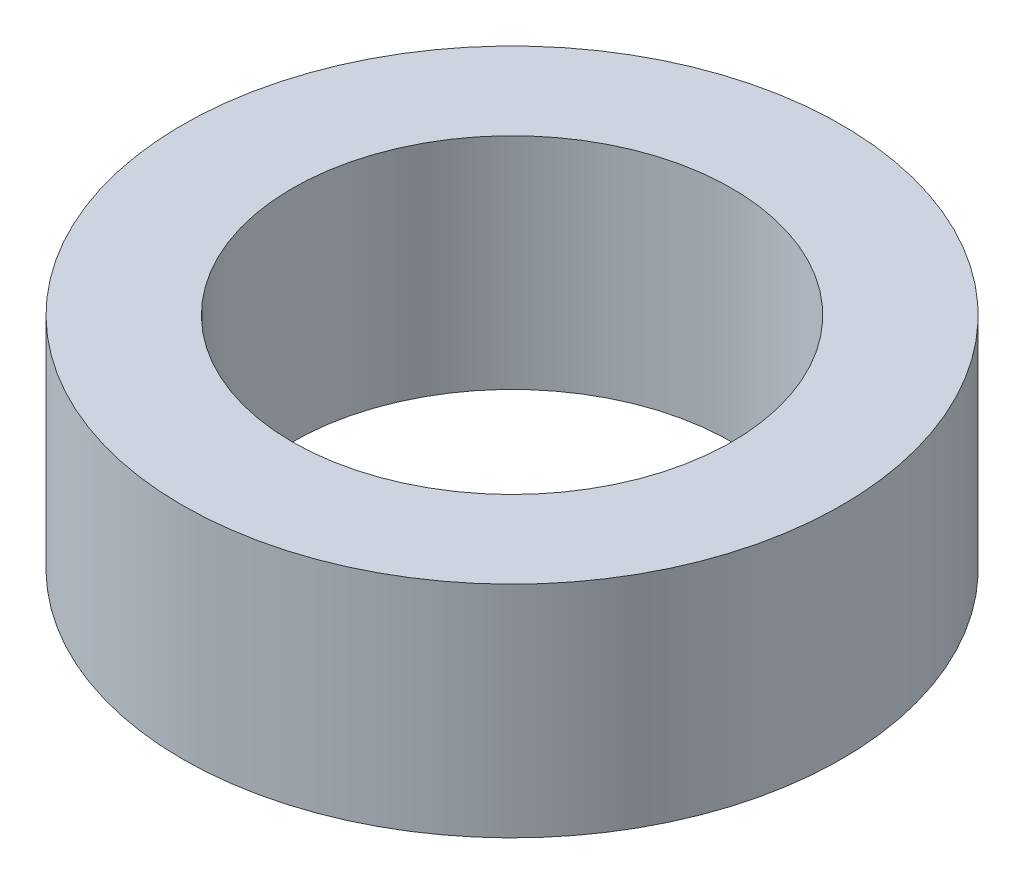
ISO-10303-21;
HEADER;
FILE_DESCRIPTION(('STEP AP214'),'2;1');
FILE_NAME('part.step','',(''),(''),'','','');
FILE_SCHEMA(('AUTOMOTIVE_DESIGN { 1 0 10303 214 1 1 1 1 }'));
ENDSEC;
DATA;
#1=APPLICATION_CONTEXT('core data for automotive mechanical design processes');
#2=APPLICATION_PROTOCOL_DEFINITION('international standard','automotive_design',2000,#1);
#3=PRODUCT_CONTEXT('',#1,'mechanical');
#4=PRODUCT('Part','Part','',(#3));
#5=PRODUCT_RELATED_PRODUCT_CATEGORY('part','',(#4));
#6=PRODUCT_DEFINITION_FORMATION('','',#4);
#7=PRODUCT_DEFINITION_CONTEXT('part definition',#1,'design');
#8=PRODUCT_DEFINITION('design','',#6,#7);
#9=PRODUCT_DEFINITION_SHAPE('','',#8);
#10=(LENGTH_UNIT() NAMED_UNIT(*) SI_UNIT(.MILLI.,.METRE.));
#11=(NAMED_UNIT(*) PLANE_ANGLE_UNIT() SI_UNIT($,.RADIAN.));
#12=(NAMED_UNIT(*) SI_UNIT($,.STERADIAN.) SOLID_ANGLE_UNIT());
#13=UNCERTAINTY_MEASURE_WITH_UNIT(LENGTH_MEASURE(1.E-05),#10,'distance_accuracy_value','');
#14=(GEOMETRIC_REPRESENTATION_CONTEXT(3) GLOBAL_UNCERTAINTY_ASSIGNED_CONTEXT((#13)) GLOBAL_UNIT_ASSIGNED_CONTEXT((#10,
#11,#12)) REPRESENTATION_CONTEXT('',''));
#15=CARTESIAN_POINT('',(0.,0.,0.));
#16=DIRECTION('',(0.,0.,1.));
#17=DIRECTION('',(1.,0.,0.));
#18=AXIS2_PLACEMENT_3D('',#15,#16,#17);
#19=CARTESIAN_POINT('',(0.,0.,0.));
#20=DIRECTION('',(0.,1.,0.));
#21=DIRECTION('',(0.,0.,1.));
#22=AXIS2_PLACEMENT_3D('',#19,#20,#21);
#23=PLANE('',#22);
#24=CARTESIAN_POINT('',(0.,0.,0.));
#25=DIRECTION('',(0.,1.,0.));
#26=DIRECTION('',(0.,0.,1.));
#27=AXIS2_PLACEMENT_3D('',#24,#25,#26);
#28=CIRCLE('',#27,19.05);
#29=CARTESIAN_POINT('',(0.,0.,19.05));
#30=VERTEX_POINT('',#29);
#31=EDGE_CURVE('E49',#30,#30,#28,.T.);
#32=ORIENTED_EDGE('',*,*,#31,.F.);
#33=EDGE_LOOP('',(#32));
#34=FACE_BOUND('',#33,.T.);
#35=CARTESIAN_POINT('',(0.,0.,0.));
#36=DIRECTION('',(0.,-1.,0.));
#37=DIRECTION('',(0.,0.,-1.));
#38=AXIS2_PLACEMENT_3D('',#35,#36,#37);
#39=CIRCLE('',#38,18.9858519733346);
#40=CARTESIAN_POINT('',(0.,0.,-18.9858519733346));
#41=VERTEX_POINT('',#40);
#42=EDGE_CURVE('E72',#41,#41,#39,.T.);
#43=ORIENTED_EDGE('',*,*,#42,.F.);
#44=EDGE_LOOP('',(#43));
#45=FACE_BOUND('',#44,.T.);
#46=ADVANCED_FACE('F45',(#34,#45),#23,.F.);
#47=CARTESIAN_POINT('',(0.,0.,0.));
#48=DIRECTION('',(0.,1.,0.));
#49=DIRECTION('',(0.,0.,1.));
#50=AXIS2_PLACEMENT_3D('',#47,#48,#49);
#51=CIRCLE('',#50,12.7);
#52=CARTESIAN_POINT('',(0.,0.,12.7));
#53=VERTEX_POINT('',#52);
#54=EDGE_CURVE('E62',#53,#53,#51,.T.);
#55=ORIENTED_EDGE('',*,*,#54,.T.);
#56=EDGE_LOOP('',(#55));
#57=FACE_BOUND('',#56,.T.);
#58=CARTESIAN_POINT('',(0.,0.,0.));
#59=DIRECTION('',(0.,-1.,0.));
#60=DIRECTION('',(0.,0.,-1.));
#61=AXIS2_PLACEMENT_3D('',#58,#59,#60);
#62=CIRCLE('',#61,12.7641480266654);
#63=CARTESIAN_POINT('',(0.,0.,-12.7641480266654));
#64=VERTEX_POINT('',#63);
#65=EDGE_CURVE('E65',#64,#64,#62,.T.);
#66=ORIENTED_EDGE('',*,*,#65,.T.);
#67=EDGE_LOOP('',(#66));
#68=FACE_BOUND('',#67,.T.);
#69=ADVANCED_FACE('F83',(#57,#68),#23,.F.);
#70=CARTESIAN_POINT('',(0.,12.7,0.));
#71=DIRECTION('',(0.,-1.,0.));
#72=DIRECTION('',(0.,0.,-1.));
#73=AXIS2_PLACEMENT_3D('',#70,#71,#72);
#74=CYLINDRICAL_SURFACE('',#73,12.7);
#75=CARTESIAN_POINT('',(0.,12.7,0.));
#76=DIRECTION('',(0.,1.,0.));
#77=DIRECTION('',(0.,0.,1.));
#78=AXIS2_PLACEMENT_3D('',#75,#76,#77);
#79=CIRCLE('',#78,12.7);
#80=CARTESIAN_POINT('',(0.,12.7,12.7));
#81=VERTEX_POINT('',#80);
#82=EDGE_CURVE('E54',#81,#81,#79,.T.);
#83=ORIENTED_EDGE('',*,*,#82,.T.);
#84=EDGE_LOOP('',(#83));
#85=FACE_BOUND('',#84,.T.);
#86=ORIENTED_EDGE('',*,*,#54,.F.);
#87=EDGE_LOOP('',(#86));
#88=FACE_BOUND('',#87,.T.);
#89=ADVANCED_FACE('F47',(#85,#88),#74,.F.);
#90=CARTESIAN_POINT('',(0.,12.7,0.));
#91=DIRECTION('',(0.,-1.,0.));
#92=DIRECTION('',(0.,0.,-1.));
#93=AXIS2_PLACEMENT_3D('',#90,#91,#92);
#94=CYLINDRICAL_SURFACE('',#93,19.05);
#95=CARTESIAN_POINT('',(0.,12.7,0.));
#96=DIRECTION('',(0.,1.,0.));
#97=DIRECTION('',(0.,0.,1.));
#98=AXIS2_PLACEMENT_3D('',#95,#96,#97);
#99=CIRCLE('',#98,19.05);
#100=CARTESIAN_POINT('',(0.,12.7,19.05));
#101=VERTEX_POINT('',#100);
#102=EDGE_CURVE('E10',#101,#101,#99,.T.);
#103=ORIENTED_EDGE('',*,*,#102,.F.);
#104=EDGE_LOOP('',(#103));
#105=FACE_BOUND('',#104,.T.);
#106=ORIENTED_EDGE('',*,*,#31,.T.);
#107=EDGE_LOOP('',(#106));
#108=FACE_BOUND('',#107,.T.);
#109=ADVANCED_FACE('F94',(#105,#108),#94,.T.);
#110=CARTESIAN_POINT('',(0.,12.7,0.));
#111=DIRECTION('',(0.,1.,0.));
#112=DIRECTION('',(0.,0.,1.));
#113=AXIS2_PLACEMENT_3D('',#110,#111,#112);
#114=PLANE('',#113);
#115=ORIENTED_EDGE('',*,*,#82,.F.);
#116=EDGE_LOOP('',(#115));
#117=FACE_BOUND('',#116,.T.);
#118=ORIENTED_EDGE('',*,*,#102,.T.);
#119=EDGE_LOOP('',(#118));
#120=FACE_BOUND('',#119,.T.);
#121=ADVANCED_FACE('F92',(#117,#120),#114,.T.);
#122=CARTESIAN_POINT('',(0.,-0.635,0.));
#123=DIRECTION('',(0.,-1.,0.));
#124=DIRECTION('',(0.,0.,-1.));
#125=AXIS2_PLACEMENT_3D('',#122,#123,#124);
#126=TOROIDAL_SURFACE('',#125,15.875,3.175);
#127=ORIENTED_EDGE('',*,*,#65,.F.);
#128=EDGE_LOOP('',(#127));
#129=FACE_BOUND('',#128,.T.);
#130=ORIENTED_EDGE('',*,*,#42,.T.);
#131=EDGE_LOOP('',(#130));
#132=FACE_BOUND('',#131,.T.);
#133=ADVANCED_FACE('F80',(#129,#132),#126,.F.);
#134=CLOSED_SHELL('',(#46,#69,#89,#109,#121,#133));
#135=MANIFOLD_SOLID_BREP('B2',#134);
#136=ADVANCED_BREP_SHAPE_REPRESENTATION('',(#18,#135),#14);
#137=SHAPE_DEFINITION_REPRESENTATION(#9,#136);
ENDSEC;
END-ISO-10303-21;
